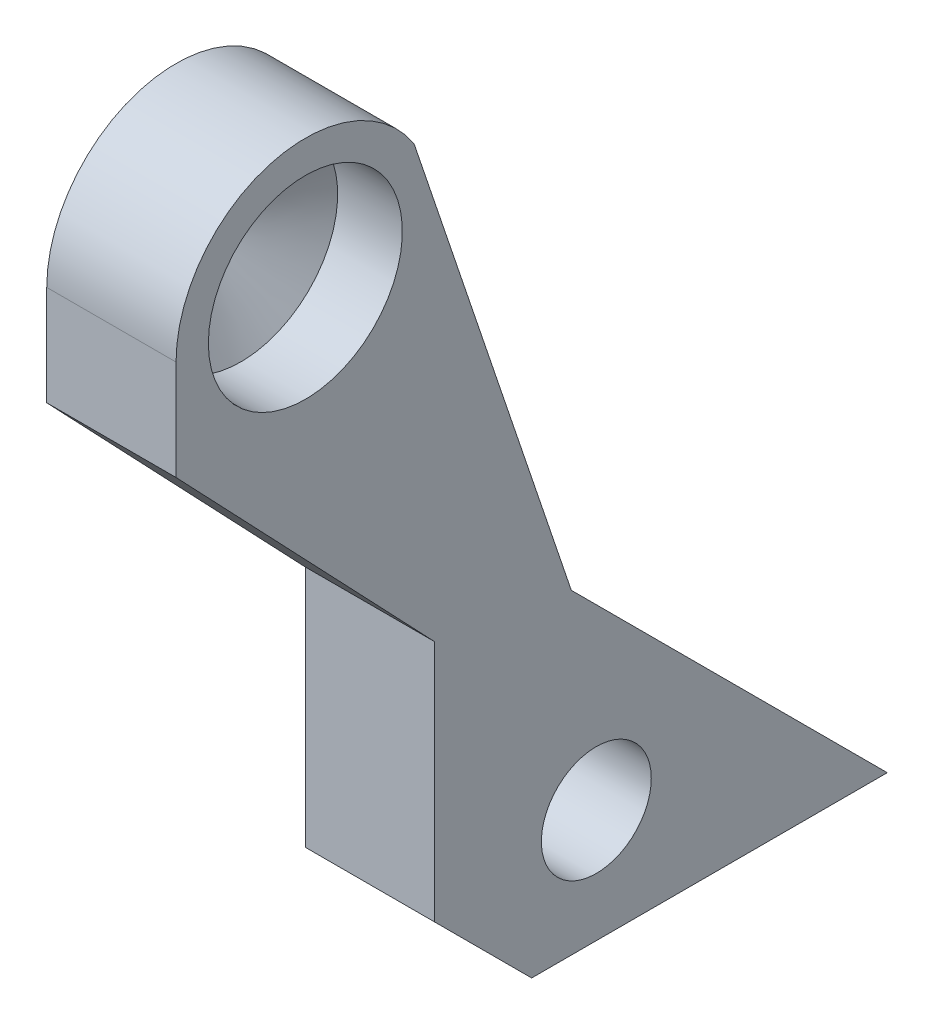
ISO-10303-21;
HEADER;
FILE_DESCRIPTION(('STEP AP214'),'2;1');
FILE_NAME('part.step','',(''),(''),'','','');
FILE_SCHEMA(('AUTOMOTIVE_DESIGN { 1 0 10303 214 1 1 1 1 }'));
ENDSEC;
DATA;
#1=APPLICATION_CONTEXT('core data for automotive mechanical design processes');
#2=APPLICATION_PROTOCOL_DEFINITION('international standard','automotive_design',2000,#1);
#3=PRODUCT_CONTEXT('',#1,'mechanical');
#4=PRODUCT('Part','Part','',(#3));
#5=PRODUCT_RELATED_PRODUCT_CATEGORY('part','',(#4));
#6=PRODUCT_DEFINITION_FORMATION('','',#4);
#7=PRODUCT_DEFINITION_CONTEXT('part definition',#1,'design');
#8=PRODUCT_DEFINITION('design','',#6,#7);
#9=PRODUCT_DEFINITION_SHAPE('','',#8);
#10=(LENGTH_UNIT() NAMED_UNIT(*) SI_UNIT(.MILLI.,.METRE.));
#11=(NAMED_UNIT(*) PLANE_ANGLE_UNIT() SI_UNIT($,.RADIAN.));
#12=(NAMED_UNIT(*) SI_UNIT($,.STERADIAN.) SOLID_ANGLE_UNIT());
#13=UNCERTAINTY_MEASURE_WITH_UNIT(LENGTH_MEASURE(1.E-05),#10,'distance_accuracy_value','');
#14=(GEOMETRIC_REPRESENTATION_CONTEXT(3) GLOBAL_UNCERTAINTY_ASSIGNED_CONTEXT((#13)) GLOBAL_UNIT_ASSIGNED_CONTEXT((#10,
#11,#12)) REPRESENTATION_CONTEXT('',''));
#15=CARTESIAN_POINT('',(0.,0.,0.));
#16=DIRECTION('',(0.,0.,1.));
#17=DIRECTION('',(1.,0.,0.));
#18=AXIS2_PLACEMENT_3D('',#15,#16,#17);
#19=CARTESIAN_POINT('',(-4.,0.,0.));
#20=DIRECTION('',(0.,0.689683794027428,-0.724110671276106));
#21=DIRECTION('',(0.,0.724110671276106,0.689683794027428));
#22=AXIS2_PLACEMENT_3D('',#19,#20,#21);
#23=PLANE('',#22);
#24=DIRECTION('',(0.,-0.724110671276106,-0.689683794027428));
#25=VECTOR('',#24,1.);
#26=CARTESIAN_POINT('',(0.,0.,0.));
#27=LINE('',#26,#25);
#28=CARTESIAN_POINT('',(0.,0.,0.));
#29=VERTEX_POINT('',#28);
#30=CARTESIAN_POINT('',(0.,-8.39933520313872,-8.));
#31=VERTEX_POINT('',#30);
#32=EDGE_CURVE('E136',#29,#31,#27,.T.);
#33=ORIENTED_EDGE('',*,*,#32,.F.);
#34=DIRECTION('',(1.,0.,0.));
#35=VECTOR('',#34,1.);
#36=CARTESIAN_POINT('',(-4.,0.,0.));
#37=LINE('',#36,#35);
#38=CARTESIAN_POINT('',(-4.,0.,0.));
#39=VERTEX_POINT('',#38);
#40=EDGE_CURVE('E135',#39,#29,#37,.T.);
#41=ORIENTED_EDGE('',*,*,#40,.F.);
#42=DIRECTION('',(0.,-0.724110671276106,-0.689683794027428));
#43=VECTOR('',#42,1.);
#44=CARTESIAN_POINT('',(-4.,0.,0.));
#45=LINE('',#44,#43);
#46=CARTESIAN_POINT('',(-4.,-8.39933520313872,-8.));
#47=VERTEX_POINT('',#46);
#48=EDGE_CURVE('E155',#39,#47,#45,.T.);
#49=ORIENTED_EDGE('',*,*,#48,.T.);
#50=DIRECTION('',(1.,0.,0.));
#51=VECTOR('',#50,1.);
#52=CARTESIAN_POINT('',(-4.,-8.39933520313872,-8.));
#53=LINE('',#52,#51);
#54=EDGE_CURVE('E11',#47,#31,#53,.T.);
#55=ORIENTED_EDGE('',*,*,#54,.T.);
#56=EDGE_LOOP('',(#33,#41,#49,#55));
#57=FACE_BOUND('',#56,.T.);
#58=ADVANCED_FACE('F39',(#57),#23,.F.);
#59=CARTESIAN_POINT('',(-4.,-8.39933520313872,-8.));
#60=DIRECTION('',(0.,0.,-1.));
#61=DIRECTION('',(1.,0.,0.));
#62=AXIS2_PLACEMENT_3D('',#59,#60,#61);
#63=PLANE('',#62);
#64=DIRECTION('',(0.,-1.,0.));
#65=VECTOR('',#64,1.);
#66=CARTESIAN_POINT('',(0.,-8.39933520313872,-8.));
#67=LINE('',#66,#65);
#68=CARTESIAN_POINT('',(0.,-15.9081605006336,-8.));
#69=VERTEX_POINT('',#68);
#70=EDGE_CURVE('E138',#31,#69,#67,.T.);
#71=ORIENTED_EDGE('',*,*,#70,.F.);
#72=ORIENTED_EDGE('',*,*,#54,.F.);
#73=DIRECTION('',(0.,-1.,0.));
#74=VECTOR('',#73,1.);
#75=CARTESIAN_POINT('',(-4.,-8.39933520313872,-8.));
#76=LINE('',#75,#74);
#77=CARTESIAN_POINT('',(-4.,-15.9081605006336,-8.));
#78=VERTEX_POINT('',#77);
#79=EDGE_CURVE('E94',#47,#78,#76,.T.);
#80=ORIENTED_EDGE('',*,*,#79,.T.);
#81=DIRECTION('',(1.,0.,0.));
#82=VECTOR('',#81,1.);
#83=CARTESIAN_POINT('',(-4.,-15.9081605006336,-8.));
#84=LINE('',#83,#82);
#85=EDGE_CURVE('E48',#78,#69,#84,.T.);
#86=ORIENTED_EDGE('',*,*,#85,.T.);
#87=EDGE_LOOP('',(#71,#72,#80,#86));
#88=FACE_BOUND('',#87,.T.);
#89=ADVANCED_FACE('F168',(#88),#63,.F.);
#90=CARTESIAN_POINT('',(-4.,-15.9081605006336,-8.));
#91=DIRECTION('',(0.,0.707106781186547,-0.707106781186547));
#92=DIRECTION('',(0.,0.707106781186548,0.707106781186548));
#93=AXIS2_PLACEMENT_3D('',#90,#91,#92);
#94=PLANE('',#93);
#95=DIRECTION('',(0.,-0.707106781186548,-0.707106781186548));
#96=VECTOR('',#95,1.);
#97=CARTESIAN_POINT('',(0.,-15.9081605006336,-8.));
#98=LINE('',#97,#96);
#99=CARTESIAN_POINT('',(0.,-18.9081605006336,-11.));
#100=VERTEX_POINT('',#99);
#101=EDGE_CURVE('E142',#69,#100,#98,.T.);
#102=ORIENTED_EDGE('',*,*,#101,.F.);
#103=ORIENTED_EDGE('',*,*,#85,.F.);
#104=DIRECTION('',(0.,-0.707106781186548,-0.707106781186548));
#105=VECTOR('',#104,1.);
#106=CARTESIAN_POINT('',(-4.,-15.9081605006336,-8.));
#107=LINE('',#106,#105);
#108=CARTESIAN_POINT('',(-4.,-18.9081605006336,-11.));
#109=VERTEX_POINT('',#108);
#110=EDGE_CURVE('E177',#78,#109,#107,.T.);
#111=ORIENTED_EDGE('',*,*,#110,.T.);
#112=DIRECTION('',(1.,0.,0.));
#113=VECTOR('',#112,1.);
#114=CARTESIAN_POINT('',(-4.,-18.9081605006336,-11.));
#115=LINE('',#114,#113);
#116=EDGE_CURVE('E162',#109,#100,#115,.T.);
#117=ORIENTED_EDGE('',*,*,#116,.T.);
#118=EDGE_LOOP('',(#102,#103,#111,#117));
#119=FACE_BOUND('',#118,.T.);
#120=ADVANCED_FACE('F189',(#119),#94,.F.);
#121=CARTESIAN_POINT('',(-4.,-18.9081605006336,-11.));
#122=DIRECTION('',(0.,1.,0.));
#123=DIRECTION('',(0.,0.,1.));
#124=AXIS2_PLACEMENT_3D('',#121,#122,#123);
#125=PLANE('',#124);
#126=DIRECTION('',(0.,0.,-1.));
#127=VECTOR('',#126,1.);
#128=CARTESIAN_POINT('',(0.,-18.9081605006336,-11.));
#129=LINE('',#128,#127);
#130=CARTESIAN_POINT('',(0.,-18.9081605006336,-22.));
#131=VERTEX_POINT('',#130);
#132=EDGE_CURVE('E145',#100,#131,#129,.T.);
#133=ORIENTED_EDGE('',*,*,#132,.F.);
#134=ORIENTED_EDGE('',*,*,#116,.F.);
#135=DIRECTION('',(0.,0.,-1.));
#136=VECTOR('',#135,1.);
#137=CARTESIAN_POINT('',(-4.,-18.9081605006336,-11.));
#138=LINE('',#137,#136);
#139=CARTESIAN_POINT('',(-4.,-18.9081605006336,-22.));
#140=VERTEX_POINT('',#139);
#141=EDGE_CURVE('E130',#109,#140,#138,.T.);
#142=ORIENTED_EDGE('',*,*,#141,.T.);
#143=DIRECTION('',(1.,0.,0.));
#144=VECTOR('',#143,1.);
#145=CARTESIAN_POINT('',(-4.,-18.9081605006336,-22.));
#146=LINE('',#145,#144);
#147=EDGE_CURVE('E159',#140,#131,#146,.T.);
#148=ORIENTED_EDGE('',*,*,#147,.T.);
#149=EDGE_LOOP('',(#133,#134,#142,#148));
#150=FACE_BOUND('',#149,.T.);
#151=ADVANCED_FACE('F185',(#150),#125,.F.);
#152=CARTESIAN_POINT('',(-4.,-18.9081605006336,-22.));
#153=DIRECTION('',(0.,-0.707106781186543,0.707106781186552));
#154=DIRECTION('',(0.,-0.707106781186552,-0.707106781186543));
#155=AXIS2_PLACEMENT_3D('',#152,#153,#154);
#156=PLANE('',#155);
#157=DIRECTION('',(0.,0.707106781186552,0.707106781186543));
#158=VECTOR('',#157,1.);
#159=CARTESIAN_POINT('',(0.,-18.9081605006336,-22.));
#160=LINE('',#159,#158);
#161=CARTESIAN_POINT('',(0.,-9.1341449956632,-12.2259844950297));
#162=VERTEX_POINT('',#161);
#163=EDGE_CURVE('E148',#131,#162,#160,.T.);
#164=ORIENTED_EDGE('',*,*,#163,.F.);
#165=ORIENTED_EDGE('',*,*,#147,.F.);
#166=DIRECTION('',(0.,0.707106781186552,0.707106781186543));
#167=VECTOR('',#166,1.);
#168=CARTESIAN_POINT('',(-4.,-18.9081605006336,-22.));
#169=LINE('',#168,#167);
#170=CARTESIAN_POINT('',(-4.,-9.1341449956632,-12.2259844950297));
#171=VERTEX_POINT('',#170);
#172=EDGE_CURVE('E128',#140,#171,#169,.T.);
#173=ORIENTED_EDGE('',*,*,#172,.T.);
#174=DIRECTION('',(1.,0.,0.));
#175=VECTOR('',#174,1.);
#176=CARTESIAN_POINT('',(-4.,-9.1341449956632,-12.2259844950297));
#177=LINE('',#176,#175);
#178=EDGE_CURVE('E122',#171,#162,#177,.T.);
#179=ORIENTED_EDGE('',*,*,#178,.T.);
#180=EDGE_LOOP('',(#164,#165,#173,#179));
#181=FACE_BOUND('',#180,.T.);
#182=ADVANCED_FACE('F188',(#181),#156,.F.);
#183=CARTESIAN_POINT('',(-4.,5.25913739827213,-7.36196665917416));
#184=DIRECTION('',(0.,-0.320149998227886,0.947366865915567));
#185=DIRECTION('',(0.,-0.947366865915567,-0.320149998227886));
#186=AXIS2_PLACEMENT_3D('',#183,#184,#185);
#187=PLANE('',#186);
#188=DIRECTION('',(0.,0.947366865915567,0.320149998227886));
#189=VECTOR('',#188,1.);
#190=CARTESIAN_POINT('',(0.,5.25913739827213,-7.36196665917416));
#191=LINE('',#190,#189);
#192=CARTESIAN_POINT('',(0.,5.25913739827213,-7.36196665917416));
#193=VERTEX_POINT('',#192);
#194=EDGE_CURVE('E151',#162,#193,#191,.T.);
#195=ORIENTED_EDGE('',*,*,#194,.F.);
#196=ORIENTED_EDGE('',*,*,#178,.F.);
#197=DIRECTION('',(0.,0.947366865915567,0.320149998227886));
#198=VECTOR('',#197,1.);
#199=CARTESIAN_POINT('',(-4.,5.25913739827213,-7.36196665917416));
#200=LINE('',#199,#198);
#201=CARTESIAN_POINT('',(-4.,5.25913739827213,-7.36196665917416));
#202=VERTEX_POINT('',#201);
#203=EDGE_CURVE('E112',#171,#202,#200,.T.);
#204=ORIENTED_EDGE('',*,*,#203,.T.);
#205=DIRECTION('',(1.,0.,0.));
#206=VECTOR('',#205,1.);
#207=CARTESIAN_POINT('',(-4.,5.25913739827213,-7.36196665917416));
#208=LINE('',#207,#206);
#209=EDGE_CURVE('E117',#202,#193,#208,.T.);
#210=ORIENTED_EDGE('',*,*,#209,.T.);
#211=EDGE_LOOP('',(#195,#196,#204,#210));
#212=FACE_BOUND('',#211,.T.);
#213=ADVANCED_FACE('F125',(#212),#187,.F.);
#214=CARTESIAN_POINT('',(-4.,3.09183949936636,-4.));
#215=DIRECTION('',(1.,0.,0.));
#216=DIRECTION('',(0.,0.,1.));
#217=AXIS2_PLACEMENT_3D('',#214,#215,#216);
#218=CYLINDRICAL_SURFACE('',#217,4.);
#219=CARTESIAN_POINT('',(0.,3.09183949936636,-4.));
#220=DIRECTION('',(1.,0.,0.));
#221=DIRECTION('',(0.,0.,1.));
#222=AXIS2_PLACEMENT_3D('',#219,#220,#221);
#223=CIRCLE('',#222,4.);
#224=CARTESIAN_POINT('',(0.,3.09183949936636,0.));
#225=VERTEX_POINT('',#224);
#226=EDGE_CURVE('E119',#193,#225,#223,.T.);
#227=ORIENTED_EDGE('',*,*,#226,.F.);
#228=ORIENTED_EDGE('',*,*,#209,.F.);
#229=CARTESIAN_POINT('',(-4.,3.09183949936636,-4.));
#230=DIRECTION('',(1.,0.,0.));
#231=DIRECTION('',(0.,0.,1.));
#232=AXIS2_PLACEMENT_3D('',#229,#230,#231);
#233=CIRCLE('',#232,4.);
#234=CARTESIAN_POINT('',(-4.,3.09183949936636,0.));
#235=VERTEX_POINT('',#234);
#236=EDGE_CURVE('E108',#202,#235,#233,.T.);
#237=ORIENTED_EDGE('',*,*,#236,.T.);
#238=DIRECTION('',(1.,0.,0.));
#239=VECTOR('',#238,1.);
#240=CARTESIAN_POINT('',(-4.,3.09183949936636,0.));
#241=LINE('',#240,#239);
#242=EDGE_CURVE('E123',#235,#225,#241,.T.);
#243=ORIENTED_EDGE('',*,*,#242,.T.);
#244=EDGE_LOOP('',(#227,#228,#237,#243));
#245=FACE_BOUND('',#244,.T.);
#246=ADVANCED_FACE('F118',(#245),#218,.T.);
#247=CARTESIAN_POINT('',(-4.,0.,0.));
#248=DIRECTION('',(0.,0.,-1.));
#249=DIRECTION('',(1.,0.,0.));
#250=AXIS2_PLACEMENT_3D('',#247,#248,#249);
#251=PLANE('',#250);
#252=DIRECTION('',(0.,-1.,0.));
#253=VECTOR('',#252,1.);
#254=CARTESIAN_POINT('',(0.,0.,0.));
#255=LINE('',#254,#253);
#256=EDGE_CURVE('E82',#225,#29,#255,.T.);
#257=ORIENTED_EDGE('',*,*,#256,.F.);
#258=ORIENTED_EDGE('',*,*,#242,.F.);
#259=DIRECTION('',(0.,-1.,0.));
#260=VECTOR('',#259,1.);
#261=CARTESIAN_POINT('',(-4.,0.,0.));
#262=LINE('',#261,#260);
#263=EDGE_CURVE('E56',#235,#39,#262,.T.);
#264=ORIENTED_EDGE('',*,*,#263,.T.);
#265=ORIENTED_EDGE('',*,*,#40,.T.);
#266=EDGE_LOOP('',(#257,#258,#264,#265));
#267=FACE_BOUND('',#266,.T.);
#268=ADVANCED_FACE('F244',(#267),#251,.F.);
#269=CARTESIAN_POINT('',(-4.,3.09183949936636,-4.));
#270=DIRECTION('',(1.,0.,0.));
#271=DIRECTION('',(0.,0.,1.));
#272=AXIS2_PLACEMENT_3D('',#269,#270,#271);
#273=PLANE('',#272);
#274=CARTESIAN_POINT('',(-4.,-15.4081605006336,-13.));
#275=DIRECTION('',(1.,0.,0.));
#276=DIRECTION('',(0.,0.,-1.));
#277=AXIS2_PLACEMENT_3D('',#274,#275,#276);
#278=CIRCLE('',#277,3.15);
#279=CARTESIAN_POINT('',(-4.,-15.4081605006336,-16.15));
#280=VERTEX_POINT('',#279);
#281=EDGE_CURVE('E357',#280,#280,#278,.T.);
#282=ORIENTED_EDGE('',*,*,#281,.T.);
#283=EDGE_LOOP('',(#282));
#284=FACE_BOUND('',#283,.T.);
#285=CARTESIAN_POINT('',(-4.,3.09183949936636,-4.));
#286=DIRECTION('',(1.,0.,0.));
#287=DIRECTION('',(0.,0.,-1.));
#288=AXIS2_PLACEMENT_3D('',#285,#286,#287);
#289=CIRCLE('',#288,1.2);
#290=CARTESIAN_POINT('',(-4.,3.09183949936636,-5.2));
#291=VERTEX_POINT('',#290);
#292=EDGE_CURVE('E364',#291,#291,#289,.T.);
#293=ORIENTED_EDGE('',*,*,#292,.T.);
#294=EDGE_LOOP('',(#293));
#295=FACE_BOUND('',#294,.T.);
#296=ORIENTED_EDGE('',*,*,#48,.F.);
#297=ORIENTED_EDGE('',*,*,#263,.F.);
#298=ORIENTED_EDGE('',*,*,#236,.F.);
#299=ORIENTED_EDGE('',*,*,#203,.F.);
#300=ORIENTED_EDGE('',*,*,#172,.F.);
#301=ORIENTED_EDGE('',*,*,#141,.F.);
#302=ORIENTED_EDGE('',*,*,#110,.F.);
#303=ORIENTED_EDGE('',*,*,#79,.F.);
#304=EDGE_LOOP('',(#296,#297,#298,#299,#300,#301,#302,#303));
#305=FACE_BOUND('',#304,.T.);
#306=ADVANCED_FACE('F110',(#284,#295,#305),#273,.F.);
#307=CARTESIAN_POINT('',(0.,3.09183949936636,-4.));
#308=DIRECTION('',(1.,0.,0.));
#309=DIRECTION('',(0.,0.,1.));
#310=AXIS2_PLACEMENT_3D('',#307,#308,#309);
#311=PLANE('',#310);
#312=CARTESIAN_POINT('',(0.,-15.4081605006336,-13.));
#313=DIRECTION('',(1.,0.,0.));
#314=DIRECTION('',(0.,0.,-1.));
#315=AXIS2_PLACEMENT_3D('',#312,#313,#314);
#316=CIRCLE('',#315,1.7);
#317=CARTESIAN_POINT('',(0.,-15.4081605006336,-14.7));
#318=VERTEX_POINT('',#317);
#319=EDGE_CURVE('E359',#318,#318,#316,.T.);
#320=ORIENTED_EDGE('',*,*,#319,.F.);
#321=EDGE_LOOP('',(#320));
#322=FACE_BOUND('',#321,.T.);
#323=CARTESIAN_POINT('',(0.,3.09183949936636,-4.));
#324=DIRECTION('',(-1.,0.,0.));
#325=DIRECTION('',(0.,0.,1.));
#326=AXIS2_PLACEMENT_3D('',#323,#324,#325);
#327=CIRCLE('',#326,2.99999999999999);
#328=CARTESIAN_POINT('',(0.,3.09183949936636,-1.00000000000001));
#329=VERTEX_POINT('',#328);
#330=EDGE_CURVE('E366',#329,#329,#327,.T.);
#331=ORIENTED_EDGE('',*,*,#330,.T.);
#332=EDGE_LOOP('',(#331));
#333=FACE_BOUND('',#332,.T.);
#334=ORIENTED_EDGE('',*,*,#32,.T.);
#335=ORIENTED_EDGE('',*,*,#70,.T.);
#336=ORIENTED_EDGE('',*,*,#101,.T.);
#337=ORIENTED_EDGE('',*,*,#132,.T.);
#338=ORIENTED_EDGE('',*,*,#163,.T.);
#339=ORIENTED_EDGE('',*,*,#194,.T.);
#340=ORIENTED_EDGE('',*,*,#226,.T.);
#341=ORIENTED_EDGE('',*,*,#256,.T.);
#342=EDGE_LOOP('',(#334,#335,#336,#337,#338,#339,#340,#341));
#343=FACE_BOUND('',#342,.T.);
#344=ADVANCED_FACE('F171',(#322,#333,#343),#311,.T.);
#345=CARTESIAN_POINT('',(-2.,3.09183949936636,-4.));
#346=DIRECTION('',(1.,0.,0.));
#347=DIRECTION('',(0.,0.,1.));
#348=AXIS2_PLACEMENT_3D('',#345,#346,#347);
#349=CONICAL_SURFACE('',#348,2.99999999999999,1.02974425867665);
#350=CARTESIAN_POINT('',(-3.08154911424961,3.09183949936636,-4.));
#351=DIRECTION('',(-1.,0.,0.));
#352=DIRECTION('',(0.,0.,1.));
#353=AXIS2_PLACEMENT_3D('',#350,#351,#352);
#354=CIRCLE('',#353,1.2);
#355=CARTESIAN_POINT('',(-3.08154911424961,3.09183949936636,-2.8));
#356=VERTEX_POINT('',#355);
#357=EDGE_CURVE('E42',#356,#356,#354,.F.);
#358=ORIENTED_EDGE('',*,*,#357,.F.);
#359=EDGE_LOOP('',(#358));
#360=FACE_BOUND('',#359,.T.);
#361=CARTESIAN_POINT('',(-2.,3.09183949936636,-4.));
#362=DIRECTION('',(-1.,0.,0.));
#363=DIRECTION('',(0.,0.,1.));
#364=AXIS2_PLACEMENT_3D('',#361,#362,#363);
#365=CIRCLE('',#364,2.99999999999999);
#366=CARTESIAN_POINT('',(-2.,3.09183949936636,-1.00000000000001));
#367=VERTEX_POINT('',#366);
#368=EDGE_CURVE('E139',#367,#367,#365,.T.);
#369=ORIENTED_EDGE('',*,*,#368,.F.);
#370=EDGE_LOOP('',(#369));
#371=FACE_BOUND('',#370,.T.);
#372=ADVANCED_FACE('F273',(#360,#371),#349,.F.);
#373=CARTESIAN_POINT('',(0.,3.09183949936636,-4.));
#374=DIRECTION('',(1.,0.,0.));
#375=DIRECTION('',(0.,0.,1.));
#376=AXIS2_PLACEMENT_3D('',#373,#374,#375);
#377=CYLINDRICAL_SURFACE('',#376,2.99999999999999);
#378=ORIENTED_EDGE('',*,*,#368,.T.);
#379=EDGE_LOOP('',(#378));
#380=FACE_BOUND('',#379,.T.);
#381=ORIENTED_EDGE('',*,*,#330,.F.);
#382=EDGE_LOOP('',(#381));
#383=FACE_BOUND('',#382,.T.);
#384=ADVANCED_FACE('F284',(#380,#383),#377,.F.);
#385=CARTESIAN_POINT('',(0.,3.09183949936636,-4.));
#386=DIRECTION('',(-1.,0.,0.));
#387=DIRECTION('',(0.,0.,-1.));
#388=AXIS2_PLACEMENT_3D('',#385,#386,#387);
#389=CYLINDRICAL_SURFACE('',#388,1.2);
#390=ORIENTED_EDGE('',*,*,#292,.F.);
#391=EDGE_LOOP('',(#390));
#392=FACE_BOUND('',#391,.T.);
#393=ORIENTED_EDGE('',*,*,#357,.T.);
#394=EDGE_LOOP('',(#393));
#395=FACE_BOUND('',#394,.T.);
#396=ADVANCED_FACE('F295',(#392,#395),#389,.F.);
#397=CARTESIAN_POINT('',(-4.,-15.4081605006336,-13.));
#398=DIRECTION('',(-1.,0.,0.));
#399=DIRECTION('',(0.,0.,-1.));
#400=AXIS2_PLACEMENT_3D('',#397,#398,#399);
#401=CYLINDRICAL_SURFACE('',#400,1.7);
#402=ORIENTED_EDGE('',*,*,#319,.T.);
#403=EDGE_LOOP('',(#402));
#404=FACE_BOUND('',#403,.T.);
#405=CARTESIAN_POINT('',(-2.55,-15.4081605006336,-13.));
#406=DIRECTION('',(1.,0.,0.));
#407=DIRECTION('',(0.,0.,-1.));
#408=AXIS2_PLACEMENT_3D('',#405,#406,#407);
#409=CIRCLE('',#408,1.7);
#410=CARTESIAN_POINT('',(-2.55,-15.4081605006336,-14.7));
#411=VERTEX_POINT('',#410);
#412=EDGE_CURVE('E354',#411,#411,#409,.T.);
#413=ORIENTED_EDGE('',*,*,#412,.F.);
#414=EDGE_LOOP('',(#413));
#415=FACE_BOUND('',#414,.T.);
#416=ADVANCED_FACE('F306',(#404,#415),#401,.F.);
#417=CARTESIAN_POINT('',(-4.,-15.4081605006336,-13.));
#418=DIRECTION('',(-1.,0.,0.));
#419=DIRECTION('',(0.,0.,-1.));
#420=AXIS2_PLACEMENT_3D('',#417,#418,#419);
#421=CONICAL_SURFACE('',#420,3.15,0.785398163397449);
#422=ORIENTED_EDGE('',*,*,#412,.T.);
#423=EDGE_LOOP('',(#422));
#424=FACE_BOUND('',#423,.T.);
#425=ORIENTED_EDGE('',*,*,#281,.F.);
#426=EDGE_LOOP('',(#425));
#427=FACE_BOUND('',#426,.T.);
#428=ADVANCED_FACE('F317',(#424,#427),#421,.F.);
#429=CLOSED_SHELL('',(#58,#89,#120,#151,#182,#213,#246,#268,#306,#344,#372,#384,#396,#416,#428));
#430=MANIFOLD_SOLID_BREP('B2',#429);
#431=ADVANCED_BREP_SHAPE_REPRESENTATION('',(#18,#430),#14);
#432=SHAPE_DEFINITION_REPRESENTATION(#9,#431);
ENDSEC;
END-ISO-10303-21;
